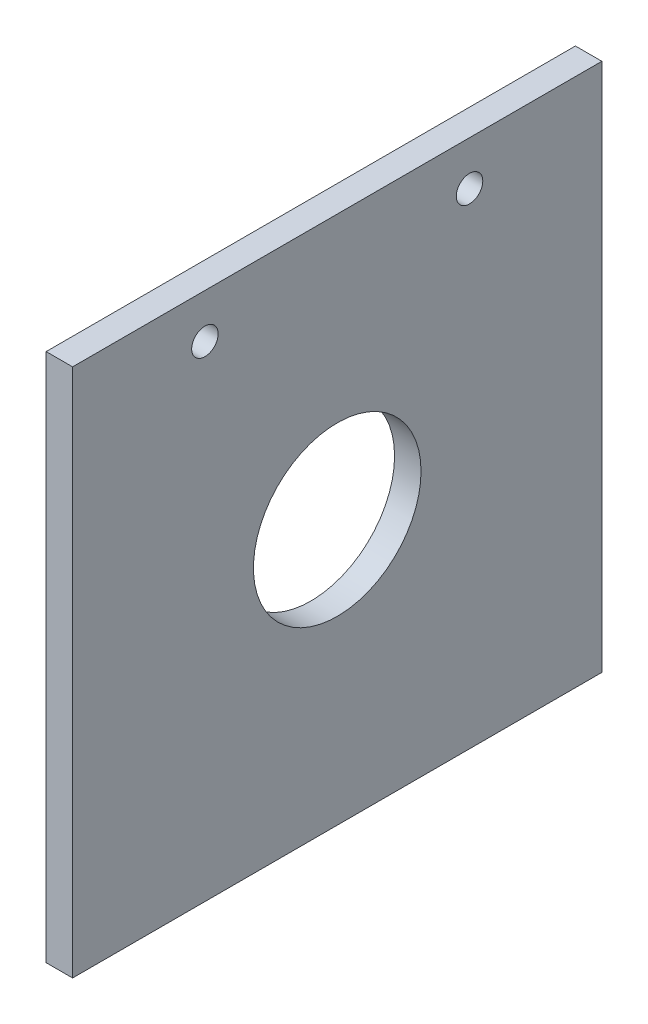
ISO-10303-21;
HEADER;
FILE_DESCRIPTION(('STEP AP214'),'2;1');
FILE_NAME('part.step','',(''),(''),'','','');
FILE_SCHEMA(('AUTOMOTIVE_DESIGN { 1 0 10303 214 1 1 1 1 }'));
ENDSEC;
DATA;
#1=APPLICATION_CONTEXT('core data for automotive mechanical design processes');
#2=APPLICATION_PROTOCOL_DEFINITION('international standard','automotive_design',2000,#1);
#3=PRODUCT_CONTEXT('',#1,'mechanical');
#4=PRODUCT('Part','Part','',(#3));
#5=PRODUCT_RELATED_PRODUCT_CATEGORY('part','',(#4));
#6=PRODUCT_DEFINITION_FORMATION('','',#4);
#7=PRODUCT_DEFINITION_CONTEXT('part definition',#1,'design');
#8=PRODUCT_DEFINITION('design','',#6,#7);
#9=PRODUCT_DEFINITION_SHAPE('','',#8);
#10=(LENGTH_UNIT() NAMED_UNIT(*) SI_UNIT(.MILLI.,.METRE.));
#11=(NAMED_UNIT(*) PLANE_ANGLE_UNIT() SI_UNIT($,.RADIAN.));
#12=(NAMED_UNIT(*) SI_UNIT($,.STERADIAN.) SOLID_ANGLE_UNIT());
#13=UNCERTAINTY_MEASURE_WITH_UNIT(LENGTH_MEASURE(1.E-05),#10,'distance_accuracy_value','');
#14=(GEOMETRIC_REPRESENTATION_CONTEXT(3) GLOBAL_UNCERTAINTY_ASSIGNED_CONTEXT((#13)) GLOBAL_UNIT_ASSIGNED_CONTEXT((#10,
#11,#12)) REPRESENTATION_CONTEXT('',''));
#15=CARTESIAN_POINT('',(0.,0.,0.));
#16=DIRECTION('',(0.,0.,1.));
#17=DIRECTION('',(1.,0.,0.));
#18=AXIS2_PLACEMENT_3D('',#15,#16,#17);
#19=CARTESIAN_POINT('',(3.,30.,-30.));
#20=DIRECTION('',(0.,0.,1.));
#21=DIRECTION('',(0.,-1.,0.));
#22=AXIS2_PLACEMENT_3D('',#19,#20,#21);
#23=PLANE('',#22);
#24=DIRECTION('',(0.,1.,0.));
#25=VECTOR('',#24,1.);
#26=CARTESIAN_POINT('',(0.,30.,-30.));
#27=LINE('',#26,#25);
#28=CARTESIAN_POINT('',(0.,-30.,-30.));
#29=VERTEX_POINT('',#28);
#30=CARTESIAN_POINT('',(0.,30.,-30.));
#31=VERTEX_POINT('',#30);
#32=EDGE_CURVE('E96',#29,#31,#27,.T.);
#33=ORIENTED_EDGE('',*,*,#32,.T.);
#34=DIRECTION('',(-1.,0.,0.));
#35=VECTOR('',#34,1.);
#36=CARTESIAN_POINT('',(3.,30.,-30.));
#37=LINE('',#36,#35);
#38=CARTESIAN_POINT('',(3.,30.,-30.));
#39=VERTEX_POINT('',#38);
#40=EDGE_CURVE('E11',#39,#31,#37,.T.);
#41=ORIENTED_EDGE('',*,*,#40,.F.);
#42=DIRECTION('',(0.,1.,0.));
#43=VECTOR('',#42,1.);
#44=CARTESIAN_POINT('',(3.,30.,-30.));
#45=LINE('',#44,#43);
#46=CARTESIAN_POINT('',(3.,-30.,-30.));
#47=VERTEX_POINT('',#46);
#48=EDGE_CURVE('E84',#47,#39,#45,.T.);
#49=ORIENTED_EDGE('',*,*,#48,.F.);
#50=DIRECTION('',(-1.,0.,0.));
#51=VECTOR('',#50,1.);
#52=CARTESIAN_POINT('',(3.,-30.,-30.));
#53=LINE('',#52,#51);
#54=EDGE_CURVE('E92',#47,#29,#53,.T.);
#55=ORIENTED_EDGE('',*,*,#54,.T.);
#56=EDGE_LOOP('',(#33,#41,#49,#55));
#57=FACE_BOUND('',#56,.T.);
#58=ADVANCED_FACE('F33',(#57),#23,.F.);
#59=CARTESIAN_POINT('',(3.,30.,30.));
#60=DIRECTION('',(0.,-1.,0.));
#61=DIRECTION('',(0.,0.,-1.));
#62=AXIS2_PLACEMENT_3D('',#59,#60,#61);
#63=PLANE('',#62);
#64=DIRECTION('',(0.,0.,1.));
#65=VECTOR('',#64,1.);
#66=CARTESIAN_POINT('',(0.,30.,30.));
#67=LINE('',#66,#65);
#68=CARTESIAN_POINT('',(0.,30.,30.));
#69=VERTEX_POINT('',#68);
#70=EDGE_CURVE('E88',#31,#69,#67,.T.);
#71=ORIENTED_EDGE('',*,*,#70,.T.);
#72=DIRECTION('',(-1.,0.,0.));
#73=VECTOR('',#72,1.);
#74=CARTESIAN_POINT('',(3.,30.,30.));
#75=LINE('',#74,#73);
#76=CARTESIAN_POINT('',(3.,30.,30.));
#77=VERTEX_POINT('',#76);
#78=EDGE_CURVE('E41',#77,#69,#75,.T.);
#79=ORIENTED_EDGE('',*,*,#78,.F.);
#80=DIRECTION('',(0.,0.,1.));
#81=VECTOR('',#80,1.);
#82=CARTESIAN_POINT('',(3.,30.,30.));
#83=LINE('',#82,#81);
#84=EDGE_CURVE('E79',#39,#77,#83,.T.);
#85=ORIENTED_EDGE('',*,*,#84,.F.);
#86=ORIENTED_EDGE('',*,*,#40,.T.);
#87=EDGE_LOOP('',(#71,#79,#85,#86));
#88=FACE_BOUND('',#87,.T.);
#89=ADVANCED_FACE('F87',(#88),#63,.F.);
#90=CARTESIAN_POINT('',(3.,30.,30.));
#91=DIRECTION('',(0.,0.,-1.));
#92=DIRECTION('',(0.,1.,0.));
#93=AXIS2_PLACEMENT_3D('',#90,#91,#92);
#94=PLANE('',#93);
#95=DIRECTION('',(0.,-1.,0.));
#96=VECTOR('',#95,1.);
#97=CARTESIAN_POINT('',(0.,30.,30.));
#98=LINE('',#97,#96);
#99=CARTESIAN_POINT('',(0.,-30.,30.));
#100=VERTEX_POINT('',#99);
#101=EDGE_CURVE('E66',#69,#100,#98,.T.);
#102=ORIENTED_EDGE('',*,*,#101,.T.);
#103=DIRECTION('',(-1.,0.,0.));
#104=VECTOR('',#103,1.);
#105=CARTESIAN_POINT('',(3.,-30.,30.));
#106=LINE('',#105,#104);
#107=CARTESIAN_POINT('',(3.,-30.,30.));
#108=VERTEX_POINT('',#107);
#109=EDGE_CURVE('E89',#108,#100,#106,.T.);
#110=ORIENTED_EDGE('',*,*,#109,.F.);
#111=DIRECTION('',(0.,-1.,0.));
#112=VECTOR('',#111,1.);
#113=CARTESIAN_POINT('',(3.,30.,30.));
#114=LINE('',#113,#112);
#115=EDGE_CURVE('E82',#77,#108,#114,.T.);
#116=ORIENTED_EDGE('',*,*,#115,.F.);
#117=ORIENTED_EDGE('',*,*,#78,.T.);
#118=EDGE_LOOP('',(#102,#110,#116,#117));
#119=FACE_BOUND('',#118,.T.);
#120=ADVANCED_FACE('F90',(#119),#94,.F.);
#121=CARTESIAN_POINT('',(3.,-30.,30.));
#122=DIRECTION('',(0.,1.,0.));
#123=DIRECTION('',(0.,0.,1.));
#124=AXIS2_PLACEMENT_3D('',#121,#122,#123);
#125=PLANE('',#124);
#126=DIRECTION('',(0.,0.,-1.));
#127=VECTOR('',#126,1.);
#128=CARTESIAN_POINT('',(0.,-30.,30.));
#129=LINE('',#128,#127);
#130=EDGE_CURVE('E72',#100,#29,#129,.T.);
#131=ORIENTED_EDGE('',*,*,#130,.T.);
#132=ORIENTED_EDGE('',*,*,#54,.F.);
#133=DIRECTION('',(0.,0.,-1.));
#134=VECTOR('',#133,1.);
#135=CARTESIAN_POINT('',(3.,-30.,30.));
#136=LINE('',#135,#134);
#137=EDGE_CURVE('E49',#108,#47,#136,.T.);
#138=ORIENTED_EDGE('',*,*,#137,.F.);
#139=ORIENTED_EDGE('',*,*,#109,.T.);
#140=EDGE_LOOP('',(#131,#132,#138,#139));
#141=FACE_BOUND('',#140,.T.);
#142=ADVANCED_FACE('F104',(#141),#125,.F.);
#143=CARTESIAN_POINT('',(3.,0.,0.));
#144=DIRECTION('',(1.,0.,0.));
#145=DIRECTION('',(0.,0.,-1.));
#146=AXIS2_PLACEMENT_3D('',#143,#144,#145);
#147=PLANE('',#146);
#148=CARTESIAN_POINT('',(3.,25.,-15.));
#149=DIRECTION('',(1.,0.,0.));
#150=DIRECTION('',(0.,0.,-1.));
#151=AXIS2_PLACEMENT_3D('',#148,#149,#150);
#152=CIRCLE('',#151,1.5);
#153=CARTESIAN_POINT('',(3.,25.,-16.5));
#154=VERTEX_POINT('',#153);
#155=EDGE_CURVE('E122',#154,#154,#152,.T.);
#156=ORIENTED_EDGE('',*,*,#155,.F.);
#157=EDGE_LOOP('',(#156));
#158=FACE_BOUND('',#157,.T.);
#159=CARTESIAN_POINT('',(3.,0.,0.));
#160=DIRECTION('',(1.,0.,0.));
#161=DIRECTION('',(0.,0.,-1.));
#162=AXIS2_PLACEMENT_3D('',#159,#160,#161);
#163=CIRCLE('',#162,9.5);
#164=CARTESIAN_POINT('',(3.,0.,-9.5));
#165=VERTEX_POINT('',#164);
#166=EDGE_CURVE('E116',#165,#165,#163,.T.);
#167=ORIENTED_EDGE('',*,*,#166,.F.);
#168=EDGE_LOOP('',(#167));
#169=FACE_BOUND('',#168,.T.);
#170=CARTESIAN_POINT('',(3.,25.,15.));
#171=DIRECTION('',(1.,0.,0.));
#172=DIRECTION('',(0.,0.,-1.));
#173=AXIS2_PLACEMENT_3D('',#170,#171,#172);
#174=CIRCLE('',#173,1.5);
#175=CARTESIAN_POINT('',(3.,25.,13.5));
#176=VERTEX_POINT('',#175);
#177=EDGE_CURVE('E110',#176,#176,#174,.T.);
#178=ORIENTED_EDGE('',*,*,#177,.F.);
#179=EDGE_LOOP('',(#178));
#180=FACE_BOUND('',#179,.T.);
#181=ORIENTED_EDGE('',*,*,#48,.T.);
#182=ORIENTED_EDGE('',*,*,#84,.T.);
#183=ORIENTED_EDGE('',*,*,#115,.T.);
#184=ORIENTED_EDGE('',*,*,#137,.T.);
#185=EDGE_LOOP('',(#181,#182,#183,#184));
#186=FACE_BOUND('',#185,.T.);
#187=ADVANCED_FACE('F80',(#158,#169,#180,#186),#147,.T.);
#188=CARTESIAN_POINT('',(0.,0.,0.));
#189=DIRECTION('',(1.,0.,0.));
#190=DIRECTION('',(0.,0.,-1.));
#191=AXIS2_PLACEMENT_3D('',#188,#189,#190);
#192=PLANE('',#191);
#193=CARTESIAN_POINT('',(0.,25.,-15.));
#194=DIRECTION('',(1.,0.,0.));
#195=DIRECTION('',(0.,0.,-1.));
#196=AXIS2_PLACEMENT_3D('',#193,#194,#195);
#197=CIRCLE('',#196,1.5);
#198=CARTESIAN_POINT('',(0.,25.,-16.5));
#199=VERTEX_POINT('',#198);
#200=EDGE_CURVE('E113',#199,#199,#197,.T.);
#201=ORIENTED_EDGE('',*,*,#200,.T.);
#202=EDGE_LOOP('',(#201));
#203=FACE_BOUND('',#202,.T.);
#204=CARTESIAN_POINT('',(0.,0.,0.));
#205=DIRECTION('',(1.,0.,0.));
#206=DIRECTION('',(0.,0.,-1.));
#207=AXIS2_PLACEMENT_3D('',#204,#205,#206);
#208=CIRCLE('',#207,9.5);
#209=CARTESIAN_POINT('',(0.,0.,-9.5));
#210=VERTEX_POINT('',#209);
#211=EDGE_CURVE('E119',#210,#210,#208,.T.);
#212=ORIENTED_EDGE('',*,*,#211,.T.);
#213=EDGE_LOOP('',(#212));
#214=FACE_BOUND('',#213,.T.);
#215=CARTESIAN_POINT('',(0.,25.,15.));
#216=DIRECTION('',(1.,0.,0.));
#217=DIRECTION('',(0.,0.,-1.));
#218=AXIS2_PLACEMENT_3D('',#215,#216,#217);
#219=CIRCLE('',#218,1.5);
#220=CARTESIAN_POINT('',(0.,25.,13.5));
#221=VERTEX_POINT('',#220);
#222=EDGE_CURVE('E99',#221,#221,#219,.T.);
#223=ORIENTED_EDGE('',*,*,#222,.T.);
#224=EDGE_LOOP('',(#223));
#225=FACE_BOUND('',#224,.T.);
#226=ORIENTED_EDGE('',*,*,#32,.F.);
#227=ORIENTED_EDGE('',*,*,#130,.F.);
#228=ORIENTED_EDGE('',*,*,#101,.F.);
#229=ORIENTED_EDGE('',*,*,#70,.F.);
#230=EDGE_LOOP('',(#226,#227,#228,#229));
#231=FACE_BOUND('',#230,.T.);
#232=ADVANCED_FACE('F107',(#203,#214,#225,#231),#192,.F.);
#233=CARTESIAN_POINT('',(0.,25.,15.));
#234=DIRECTION('',(1.,0.,0.));
#235=DIRECTION('',(0.,0.,-1.));
#236=AXIS2_PLACEMENT_3D('',#233,#234,#235);
#237=CYLINDRICAL_SURFACE('',#236,1.5);
#238=ORIENTED_EDGE('',*,*,#222,.F.);
#239=EDGE_LOOP('',(#238));
#240=FACE_BOUND('',#239,.T.);
#241=ORIENTED_EDGE('',*,*,#177,.T.);
#242=EDGE_LOOP('',(#241));
#243=FACE_BOUND('',#242,.T.);
#244=ADVANCED_FACE('F144',(#240,#243),#237,.F.);
#245=CARTESIAN_POINT('',(0.,0.,0.));
#246=DIRECTION('',(1.,0.,0.));
#247=DIRECTION('',(0.,0.,-1.));
#248=AXIS2_PLACEMENT_3D('',#245,#246,#247);
#249=CYLINDRICAL_SURFACE('',#248,9.5);
#250=ORIENTED_EDGE('',*,*,#211,.F.);
#251=EDGE_LOOP('',(#250));
#252=FACE_BOUND('',#251,.T.);
#253=ORIENTED_EDGE('',*,*,#166,.T.);
#254=EDGE_LOOP('',(#253));
#255=FACE_BOUND('',#254,.T.);
#256=ADVANCED_FACE('F133',(#252,#255),#249,.F.);
#257=CARTESIAN_POINT('',(0.,25.,-15.));
#258=DIRECTION('',(1.,0.,0.));
#259=DIRECTION('',(0.,0.,-1.));
#260=AXIS2_PLACEMENT_3D('',#257,#258,#259);
#261=CYLINDRICAL_SURFACE('',#260,1.5);
#262=ORIENTED_EDGE('',*,*,#200,.F.);
#263=EDGE_LOOP('',(#262));
#264=FACE_BOUND('',#263,.T.);
#265=ORIENTED_EDGE('',*,*,#155,.T.);
#266=EDGE_LOOP('',(#265));
#267=FACE_BOUND('',#266,.T.);
#268=ADVANCED_FACE('F130',(#264,#267),#261,.F.);
#269=CLOSED_SHELL('',(#58,#89,#120,#142,#187,#232,#244,#256,#268));
#270=MANIFOLD_SOLID_BREP('B2',#269);
#271=ADVANCED_BREP_SHAPE_REPRESENTATION('',(#18,#270),#14);
#272=SHAPE_DEFINITION_REPRESENTATION(#9,#271);
ENDSEC;
END-ISO-10303-21;
